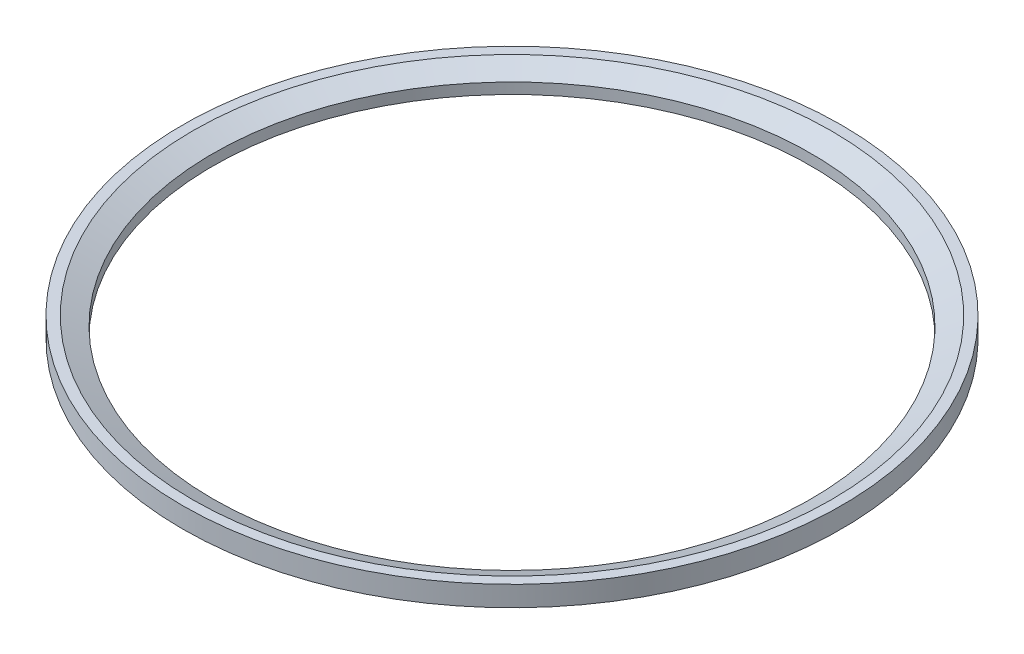
ISO-10303-21;
HEADER;
FILE_DESCRIPTION(('STEP AP214'),'2;1');
FILE_NAME('part.step','',(''),(''),'','','');
FILE_SCHEMA(('AUTOMOTIVE_DESIGN { 1 0 10303 214 1 1 1 1 }'));
ENDSEC;
DATA;
#1=APPLICATION_CONTEXT('core data for automotive mechanical design processes');
#2=APPLICATION_PROTOCOL_DEFINITION('international standard','automotive_design',2000,#1);
#3=PRODUCT_CONTEXT('',#1,'mechanical');
#4=PRODUCT('Part','Part','',(#3));
#5=PRODUCT_RELATED_PRODUCT_CATEGORY('part','',(#4));
#6=PRODUCT_DEFINITION_FORMATION('','',#4);
#7=PRODUCT_DEFINITION_CONTEXT('part definition',#1,'design');
#8=PRODUCT_DEFINITION('design','',#6,#7);
#9=PRODUCT_DEFINITION_SHAPE('','',#8);
#10=(LENGTH_UNIT() NAMED_UNIT(*) SI_UNIT(.MILLI.,.METRE.));
#11=(NAMED_UNIT(*) PLANE_ANGLE_UNIT() SI_UNIT($,.RADIAN.));
#12=(NAMED_UNIT(*) SI_UNIT($,.STERADIAN.) SOLID_ANGLE_UNIT());
#13=UNCERTAINTY_MEASURE_WITH_UNIT(LENGTH_MEASURE(1.E-05),#10,'distance_accuracy_value','');
#14=(GEOMETRIC_REPRESENTATION_CONTEXT(3) GLOBAL_UNCERTAINTY_ASSIGNED_CONTEXT((#13)) GLOBAL_UNIT_ASSIGNED_CONTEXT((#10,
#11,#12)) REPRESENTATION_CONTEXT('',''));
#15=CARTESIAN_POINT('',(0.,0.,0.));
#16=DIRECTION('',(0.,0.,1.));
#17=DIRECTION('',(1.,0.,0.));
#18=AXIS2_PLACEMENT_3D('',#15,#16,#17);
#19=CARTESIAN_POINT('',(0.,238.,0.));
#20=DIRECTION('',(0.,1.,0.));
#21=DIRECTION('',(0.,0.,1.));
#22=AXIS2_PLACEMENT_3D('',#19,#20,#21);
#23=PLANE('',#22);
#24=CARTESIAN_POINT('',(0.,238.,0.));
#25=DIRECTION('',(0.,1.,0.));
#26=DIRECTION('',(0.,0.,1.));
#27=AXIS2_PLACEMENT_3D('',#24,#25,#26);
#28=CIRCLE('',#27,157.5);
#29=CARTESIAN_POINT('',(0.,238.,157.5));
#30=VERTEX_POINT('',#29);
#31=EDGE_CURVE('E10',#30,#30,#28,.F.);
#32=ORIENTED_EDGE('',*,*,#31,.T.);
#33=EDGE_LOOP('',(#32));
#34=FACE_BOUND('',#33,.T.);
#35=CARTESIAN_POINT('',(0.,238.,0.));
#36=DIRECTION('',(0.,1.,0.));
#37=DIRECTION('',(0.,0.,1.));
#38=AXIS2_PLACEMENT_3D('',#35,#36,#37);
#39=CIRCLE('',#38,162.5);
#40=CARTESIAN_POINT('',(0.,238.,162.5));
#41=VERTEX_POINT('',#40);
#42=EDGE_CURVE('E59',#41,#41,#39,.T.);
#43=ORIENTED_EDGE('',*,*,#42,.T.);
#44=EDGE_LOOP('',(#43));
#45=FACE_BOUND('',#44,.T.);
#46=ADVANCED_FACE('F45',(#34,#45),#23,.T.);
#47=CARTESIAN_POINT('',(0.,228.,0.));
#48=DIRECTION('',(0.,1.,0.));
#49=DIRECTION('',(0.,0.,1.));
#50=AXIS2_PLACEMENT_3D('',#47,#48,#49);
#51=PLANE('',#50);
#52=CARTESIAN_POINT('',(0.,228.,0.));
#53=DIRECTION('',(0.,1.,0.));
#54=DIRECTION('',(0.,0.,1.));
#55=AXIS2_PLACEMENT_3D('',#52,#53,#54);
#56=CIRCLE('',#55,162.5);
#57=CARTESIAN_POINT('',(0.,228.,162.5));
#58=VERTEX_POINT('',#57);
#59=EDGE_CURVE('E64',#58,#58,#56,.T.);
#60=ORIENTED_EDGE('',*,*,#59,.F.);
#61=EDGE_LOOP('',(#60));
#62=FACE_BOUND('',#61,.T.);
#63=CARTESIAN_POINT('',(0.,228.,0.));
#64=DIRECTION('',(0.,1.,0.));
#65=DIRECTION('',(0.,0.,1.));
#66=AXIS2_PLACEMENT_3D('',#63,#64,#65);
#67=CIRCLE('',#66,147.5);
#68=CARTESIAN_POINT('',(0.,228.,147.5));
#69=VERTEX_POINT('',#68);
#70=EDGE_CURVE('E69',#69,#69,#67,.T.);
#71=ORIENTED_EDGE('',*,*,#70,.T.);
#72=EDGE_LOOP('',(#71));
#73=FACE_BOUND('',#72,.T.);
#74=ADVANCED_FACE('F75',(#62,#73),#51,.F.);
#75=CARTESIAN_POINT('',(0.,238.,0.));
#76=DIRECTION('',(0.,-1.,0.));
#77=DIRECTION('',(0.,0.,-1.));
#78=AXIS2_PLACEMENT_3D('',#75,#76,#77);
#79=CYLINDRICAL_SURFACE('',#78,162.5);
#80=ORIENTED_EDGE('',*,*,#42,.F.);
#81=EDGE_LOOP('',(#80));
#82=FACE_BOUND('',#81,.T.);
#83=ORIENTED_EDGE('',*,*,#59,.T.);
#84=EDGE_LOOP('',(#83));
#85=FACE_BOUND('',#84,.T.);
#86=ADVANCED_FACE('F79',(#82,#85),#79,.T.);
#87=CARTESIAN_POINT('',(0.,238.,0.));
#88=DIRECTION('',(0.,-1.,0.));
#89=DIRECTION('',(0.,0.,-1.));
#90=AXIS2_PLACEMENT_3D('',#87,#88,#89);
#91=CYLINDRICAL_SURFACE('',#90,147.5);
#92=CARTESIAN_POINT('',(0.,233.33692341845,0.));
#93=DIRECTION('',(0.,1.,0.));
#94=DIRECTION('',(0.,0.,1.));
#95=AXIS2_PLACEMENT_3D('',#92,#93,#94);
#96=CIRCLE('',#95,147.5);
#97=CARTESIAN_POINT('',(0.,233.33692341845,147.5));
#98=VERTEX_POINT('',#97);
#99=EDGE_CURVE('E54',#98,#98,#96,.T.);
#100=ORIENTED_EDGE('',*,*,#99,.T.);
#101=EDGE_LOOP('',(#100));
#102=FACE_BOUND('',#101,.T.);
#103=ORIENTED_EDGE('',*,*,#70,.F.);
#104=EDGE_LOOP('',(#103));
#105=FACE_BOUND('',#104,.T.);
#106=ADVANCED_FACE('F77',(#102,#105),#91,.F.);
#107=CARTESIAN_POINT('',(0.,233.33692341845,0.));
#108=DIRECTION('',(0.,1.,0.));
#109=DIRECTION('',(0.,0.,1.));
#110=AXIS2_PLACEMENT_3D('',#107,#108,#109);
#111=CONICAL_SURFACE('',#110,147.5,1.13446401379632);
#112=ORIENTED_EDGE('',*,*,#31,.F.);
#113=EDGE_LOOP('',(#112));
#114=FACE_BOUND('',#113,.T.);
#115=ORIENTED_EDGE('',*,*,#99,.F.);
#116=EDGE_LOOP('',(#115));
#117=FACE_BOUND('',#116,.T.);
#118=ADVANCED_FACE('F48',(#114,#117),#111,.F.);
#119=CLOSED_SHELL('',(#46,#74,#86,#106,#118));
#120=MANIFOLD_SOLID_BREP('B2',#119);
#121=ADVANCED_BREP_SHAPE_REPRESENTATION('',(#18,#120),#14);
#122=SHAPE_DEFINITION_REPRESENTATION(#9,#121);
ENDSEC;
END-ISO-10303-21;
